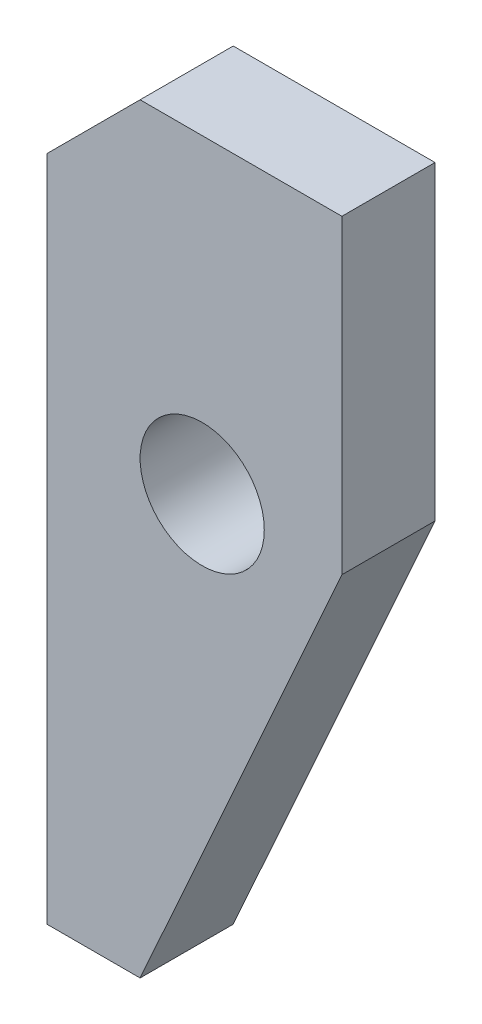
ISO-10303-21;
HEADER;
FILE_DESCRIPTION(('STEP AP214'),'2;1');
FILE_NAME('part.step','',(''),(''),'','','');
FILE_SCHEMA(('AUTOMOTIVE_DESIGN { 1 0 10303 214 1 1 1 1 }'));
ENDSEC;
DATA;
#1=APPLICATION_CONTEXT('core data for automotive mechanical design processes');
#2=APPLICATION_PROTOCOL_DEFINITION('international standard','automotive_design',2000,#1);
#3=PRODUCT_CONTEXT('',#1,'mechanical');
#4=PRODUCT('Part','Part','',(#3));
#5=PRODUCT_RELATED_PRODUCT_CATEGORY('part','',(#4));
#6=PRODUCT_DEFINITION_FORMATION('','',#4);
#7=PRODUCT_DEFINITION_CONTEXT('part definition',#1,'design');
#8=PRODUCT_DEFINITION('design','',#6,#7);
#9=PRODUCT_DEFINITION_SHAPE('','',#8);
#10=(LENGTH_UNIT() NAMED_UNIT(*) SI_UNIT(.MILLI.,.METRE.));
#11=(NAMED_UNIT(*) PLANE_ANGLE_UNIT() SI_UNIT($,.RADIAN.));
#12=(NAMED_UNIT(*) SI_UNIT($,.STERADIAN.) SOLID_ANGLE_UNIT());
#13=UNCERTAINTY_MEASURE_WITH_UNIT(LENGTH_MEASURE(1.E-05),#10,'distance_accuracy_value','');
#14=(GEOMETRIC_REPRESENTATION_CONTEXT(3) GLOBAL_UNCERTAINTY_ASSIGNED_CONTEXT((#13)) GLOBAL_UNIT_ASSIGNED_CONTEXT((#10,
#11,#12)) REPRESENTATION_CONTEXT('',''));
#15=CARTESIAN_POINT('',(0.,0.,0.));
#16=DIRECTION('',(0.,0.,1.));
#17=DIRECTION('',(1.,0.,0.));
#18=AXIS2_PLACEMENT_3D('',#15,#16,#17);
#19=CARTESIAN_POINT('',(-30.,-30.,30.));
#20=DIRECTION('',(0.707106781186548,-0.707106781186547,0.));
#21=DIRECTION('',(0.707106781186547,0.707106781186548,0.));
#22=AXIS2_PLACEMENT_3D('',#19,#20,#21);
#23=PLANE('',#22);
#24=DIRECTION('',(-0.707106781186547,-0.707106781186548,0.));
#25=VECTOR('',#24,1.);
#26=CARTESIAN_POINT('',(-30.,-30.,0.));
#27=LINE('',#26,#25);
#28=CARTESIAN_POINT('',(0.,0.,0.));
#29=VERTEX_POINT('',#28);
#30=CARTESIAN_POINT('',(-30.,-30.,0.));
#31=VERTEX_POINT('',#30);
#32=EDGE_CURVE('E119',#29,#31,#27,.T.);
#33=ORIENTED_EDGE('',*,*,#32,.T.);
#34=DIRECTION('',(0.,0.,-1.));
#35=VECTOR('',#34,1.);
#36=CARTESIAN_POINT('',(-30.,-30.,30.));
#37=LINE('',#36,#35);
#38=CARTESIAN_POINT('',(-30.,-30.,30.));
#39=VERTEX_POINT('',#38);
#40=EDGE_CURVE('E11',#39,#31,#37,.T.);
#41=ORIENTED_EDGE('',*,*,#40,.F.);
#42=DIRECTION('',(-0.707106781186547,-0.707106781186548,0.));
#43=VECTOR('',#42,1.);
#44=CARTESIAN_POINT('',(-30.,-30.,30.));
#45=LINE('',#44,#43);
#46=CARTESIAN_POINT('',(0.,0.,30.));
#47=VERTEX_POINT('',#46);
#48=EDGE_CURVE('E130',#47,#39,#45,.T.);
#49=ORIENTED_EDGE('',*,*,#48,.F.);
#50=DIRECTION('',(0.,0.,-1.));
#51=VECTOR('',#50,1.);
#52=CARTESIAN_POINT('',(0.,0.,30.));
#53=LINE('',#52,#51);
#54=EDGE_CURVE('E115',#47,#29,#53,.T.);
#55=ORIENTED_EDGE('',*,*,#54,.T.);
#56=EDGE_LOOP('',(#33,#41,#49,#55));
#57=FACE_BOUND('',#56,.T.);
#58=ADVANCED_FACE('F35',(#57),#23,.F.);
#59=CARTESIAN_POINT('',(-30.,-245.,30.));
#60=DIRECTION('',(1.,0.,0.));
#61=DIRECTION('',(0.,1.,0.));
#62=AXIS2_PLACEMENT_3D('',#59,#60,#61);
#63=PLANE('',#62);
#64=DIRECTION('',(0.,-1.,0.));
#65=VECTOR('',#64,1.);
#66=CARTESIAN_POINT('',(-30.,-245.,0.));
#67=LINE('',#66,#65);
#68=CARTESIAN_POINT('',(-30.,-245.,0.));
#69=VERTEX_POINT('',#68);
#70=EDGE_CURVE('E122',#31,#69,#67,.T.);
#71=ORIENTED_EDGE('',*,*,#70,.T.);
#72=DIRECTION('',(0.,0.,-1.));
#73=VECTOR('',#72,1.);
#74=CARTESIAN_POINT('',(-30.,-245.,30.));
#75=LINE('',#74,#73);
#76=CARTESIAN_POINT('',(-30.,-245.,30.));
#77=VERTEX_POINT('',#76);
#78=EDGE_CURVE('E43',#77,#69,#75,.T.);
#79=ORIENTED_EDGE('',*,*,#78,.F.);
#80=DIRECTION('',(0.,-1.,0.));
#81=VECTOR('',#80,1.);
#82=CARTESIAN_POINT('',(-30.,-245.,30.));
#83=LINE('',#82,#81);
#84=EDGE_CURVE('E88',#39,#77,#83,.T.);
#85=ORIENTED_EDGE('',*,*,#84,.F.);
#86=ORIENTED_EDGE('',*,*,#40,.T.);
#87=EDGE_LOOP('',(#71,#79,#85,#86));
#88=FACE_BOUND('',#87,.T.);
#89=ADVANCED_FACE('F155',(#88),#63,.F.);
#90=CARTESIAN_POINT('',(0.,-245.,30.));
#91=DIRECTION('',(0.,1.,0.));
#92=DIRECTION('',(-1.,0.,0.));
#93=AXIS2_PLACEMENT_3D('',#90,#91,#92);
#94=PLANE('',#93);
#95=DIRECTION('',(1.,0.,0.));
#96=VECTOR('',#95,1.);
#97=CARTESIAN_POINT('',(0.,-245.,0.));
#98=LINE('',#97,#96);
#99=CARTESIAN_POINT('',(0.,-245.,0.));
#100=VERTEX_POINT('',#99);
#101=EDGE_CURVE('E125',#69,#100,#98,.T.);
#102=ORIENTED_EDGE('',*,*,#101,.T.);
#103=DIRECTION('',(0.,0.,-1.));
#104=VECTOR('',#103,1.);
#105=CARTESIAN_POINT('',(0.,-245.,30.));
#106=LINE('',#105,#104);
#107=CARTESIAN_POINT('',(0.,-245.,30.));
#108=VERTEX_POINT('',#107);
#109=EDGE_CURVE('E110',#108,#100,#106,.T.);
#110=ORIENTED_EDGE('',*,*,#109,.F.);
#111=DIRECTION('',(1.,0.,0.));
#112=VECTOR('',#111,1.);
#113=CARTESIAN_POINT('',(0.,-245.,30.));
#114=LINE('',#113,#112);
#115=EDGE_CURVE('E101',#77,#108,#114,.T.);
#116=ORIENTED_EDGE('',*,*,#115,.F.);
#117=ORIENTED_EDGE('',*,*,#78,.T.);
#118=EDGE_LOOP('',(#102,#110,#116,#117));
#119=FACE_BOUND('',#118,.T.);
#120=ADVANCED_FACE('F136',(#119),#94,.F.);
#121=CARTESIAN_POINT('',(65.,-100.,30.));
#122=DIRECTION('',(-0.912509324514951,0.409055904092909,0.));
#123=DIRECTION('',(-0.409055904092909,-0.912509324514951,0.));
#124=AXIS2_PLACEMENT_3D('',#121,#122,#123);
#125=PLANE('',#124);
#126=DIRECTION('',(0.409055904092909,0.912509324514951,0.));
#127=VECTOR('',#126,1.);
#128=CARTESIAN_POINT('',(65.,-100.,0.));
#129=LINE('',#128,#127);
#130=CARTESIAN_POINT('',(65.,-100.,0.));
#131=VERTEX_POINT('',#130);
#132=EDGE_CURVE('E109',#100,#131,#129,.T.);
#133=ORIENTED_EDGE('',*,*,#132,.T.);
#134=DIRECTION('',(0.,0.,-1.));
#135=VECTOR('',#134,1.);
#136=CARTESIAN_POINT('',(65.,-100.,30.));
#137=LINE('',#136,#135);
#138=CARTESIAN_POINT('',(65.,-100.,30.));
#139=VERTEX_POINT('',#138);
#140=EDGE_CURVE('E106',#139,#131,#137,.T.);
#141=ORIENTED_EDGE('',*,*,#140,.F.);
#142=DIRECTION('',(0.409055904092909,0.912509324514951,0.));
#143=VECTOR('',#142,1.);
#144=CARTESIAN_POINT('',(65.,-100.,30.));
#145=LINE('',#144,#143);
#146=EDGE_CURVE('E95',#108,#139,#145,.T.);
#147=ORIENTED_EDGE('',*,*,#146,.F.);
#148=ORIENTED_EDGE('',*,*,#109,.T.);
#149=EDGE_LOOP('',(#133,#141,#147,#148));
#150=FACE_BOUND('',#149,.T.);
#151=ADVANCED_FACE('F107',(#150),#125,.F.);
#152=CARTESIAN_POINT('',(65.,0.,30.));
#153=DIRECTION('',(-1.,0.,0.));
#154=DIRECTION('',(0.,-1.,0.));
#155=AXIS2_PLACEMENT_3D('',#152,#153,#154);
#156=PLANE('',#155);
#157=DIRECTION('',(0.,1.,0.));
#158=VECTOR('',#157,1.);
#159=CARTESIAN_POINT('',(65.,0.,0.));
#160=LINE('',#159,#158);
#161=CARTESIAN_POINT('',(65.,0.,0.));
#162=VERTEX_POINT('',#161);
#163=EDGE_CURVE('E74',#131,#162,#160,.T.);
#164=ORIENTED_EDGE('',*,*,#163,.T.);
#165=DIRECTION('',(0.,0.,-1.));
#166=VECTOR('',#165,1.);
#167=CARTESIAN_POINT('',(65.,0.,30.));
#168=LINE('',#167,#166);
#169=CARTESIAN_POINT('',(65.,0.,30.));
#170=VERTEX_POINT('',#169);
#171=EDGE_CURVE('E111',#170,#162,#168,.T.);
#172=ORIENTED_EDGE('',*,*,#171,.F.);
#173=DIRECTION('',(0.,1.,0.));
#174=VECTOR('',#173,1.);
#175=CARTESIAN_POINT('',(65.,0.,30.));
#176=LINE('',#175,#174);
#177=EDGE_CURVE('E99',#139,#170,#176,.T.);
#178=ORIENTED_EDGE('',*,*,#177,.F.);
#179=ORIENTED_EDGE('',*,*,#140,.T.);
#180=EDGE_LOOP('',(#164,#172,#178,#179));
#181=FACE_BOUND('',#180,.T.);
#182=ADVANCED_FACE('F113',(#181),#156,.F.);
#183=CARTESIAN_POINT('',(0.,0.,30.));
#184=DIRECTION('',(0.,-1.,0.));
#185=DIRECTION('',(0.,0.,-1.));
#186=AXIS2_PLACEMENT_3D('',#183,#184,#185);
#187=PLANE('',#186);
#188=DIRECTION('',(-1.,0.,0.));
#189=VECTOR('',#188,1.);
#190=CARTESIAN_POINT('',(0.,0.,0.));
#191=LINE('',#190,#189);
#192=EDGE_CURVE('E80',#162,#29,#191,.T.);
#193=ORIENTED_EDGE('',*,*,#192,.T.);
#194=ORIENTED_EDGE('',*,*,#54,.F.);
#195=DIRECTION('',(-1.,0.,0.));
#196=VECTOR('',#195,1.);
#197=CARTESIAN_POINT('',(0.,0.,30.));
#198=LINE('',#197,#196);
#199=EDGE_CURVE('E51',#170,#47,#198,.T.);
#200=ORIENTED_EDGE('',*,*,#199,.F.);
#201=ORIENTED_EDGE('',*,*,#171,.T.);
#202=EDGE_LOOP('',(#193,#194,#200,#201));
#203=FACE_BOUND('',#202,.T.);
#204=ADVANCED_FACE('F143',(#203),#187,.F.);
#205=CARTESIAN_POINT('',(0.,0.,30.));
#206=DIRECTION('',(0.,0.,-1.));
#207=DIRECTION('',(-1.,0.,0.));
#208=AXIS2_PLACEMENT_3D('',#205,#206,#207);
#209=PLANE('',#208);
#210=CARTESIAN_POINT('',(20.,-100.,30.));
#211=DIRECTION('',(0.,0.,1.));
#212=DIRECTION('',(1.,0.,0.));
#213=AXIS2_PLACEMENT_3D('',#210,#211,#212);
#214=CIRCLE('',#213,20.);
#215=CARTESIAN_POINT('',(40.,-100.,30.));
#216=VERTEX_POINT('',#215);
#217=EDGE_CURVE('E210',#216,#216,#214,.T.);
#218=ORIENTED_EDGE('',*,*,#217,.F.);
#219=EDGE_LOOP('',(#218));
#220=FACE_BOUND('',#219,.T.);
#221=ORIENTED_EDGE('',*,*,#48,.T.);
#222=ORIENTED_EDGE('',*,*,#84,.T.);
#223=ORIENTED_EDGE('',*,*,#115,.T.);
#224=ORIENTED_EDGE('',*,*,#146,.T.);
#225=ORIENTED_EDGE('',*,*,#177,.T.);
#226=ORIENTED_EDGE('',*,*,#199,.T.);
#227=EDGE_LOOP('',(#221,#222,#223,#224,#225,#226));
#228=FACE_BOUND('',#227,.T.);
#229=ADVANCED_FACE('F97',(#220,#228),#209,.F.);
#230=CARTESIAN_POINT('',(0.,0.,0.));
#231=DIRECTION('',(0.,0.,-1.));
#232=DIRECTION('',(-1.,0.,0.));
#233=AXIS2_PLACEMENT_3D('',#230,#231,#232);
#234=PLANE('',#233);
#235=CARTESIAN_POINT('',(20.,-100.,0.));
#236=DIRECTION('',(0.,0.,1.));
#237=DIRECTION('',(1.,0.,0.));
#238=AXIS2_PLACEMENT_3D('',#235,#236,#237);
#239=CIRCLE('',#238,20.);
#240=CARTESIAN_POINT('',(40.,-100.,0.));
#241=VERTEX_POINT('',#240);
#242=EDGE_CURVE('E123',#241,#241,#239,.T.);
#243=ORIENTED_EDGE('',*,*,#242,.T.);
#244=EDGE_LOOP('',(#243));
#245=FACE_BOUND('',#244,.T.);
#246=ORIENTED_EDGE('',*,*,#32,.F.);
#247=ORIENTED_EDGE('',*,*,#192,.F.);
#248=ORIENTED_EDGE('',*,*,#163,.F.);
#249=ORIENTED_EDGE('',*,*,#132,.F.);
#250=ORIENTED_EDGE('',*,*,#101,.F.);
#251=ORIENTED_EDGE('',*,*,#70,.F.);
#252=EDGE_LOOP('',(#246,#247,#248,#249,#250,#251));
#253=FACE_BOUND('',#252,.T.);
#254=ADVANCED_FACE('F139',(#245,#253),#234,.T.);
#255=CARTESIAN_POINT('',(20.,-100.,0.));
#256=DIRECTION('',(0.,0.,1.));
#257=DIRECTION('',(1.,0.,0.));
#258=AXIS2_PLACEMENT_3D('',#255,#256,#257);
#259=CYLINDRICAL_SURFACE('',#258,20.);
#260=ORIENTED_EDGE('',*,*,#242,.F.);
#261=EDGE_LOOP('',(#260));
#262=FACE_BOUND('',#261,.T.);
#263=ORIENTED_EDGE('',*,*,#217,.T.);
#264=EDGE_LOOP('',(#263));
#265=FACE_BOUND('',#264,.T.);
#266=ADVANCED_FACE('F192',(#262,#265),#259,.F.);
#267=CLOSED_SHELL('',(#58,#89,#120,#151,#182,#204,#229,#254,#266));
#268=MANIFOLD_SOLID_BREP('B2',#267);
#269=ADVANCED_BREP_SHAPE_REPRESENTATION('',(#18,#268),#14);
#270=SHAPE_DEFINITION_REPRESENTATION(#9,#269);
ENDSEC;
END-ISO-10303-21;
